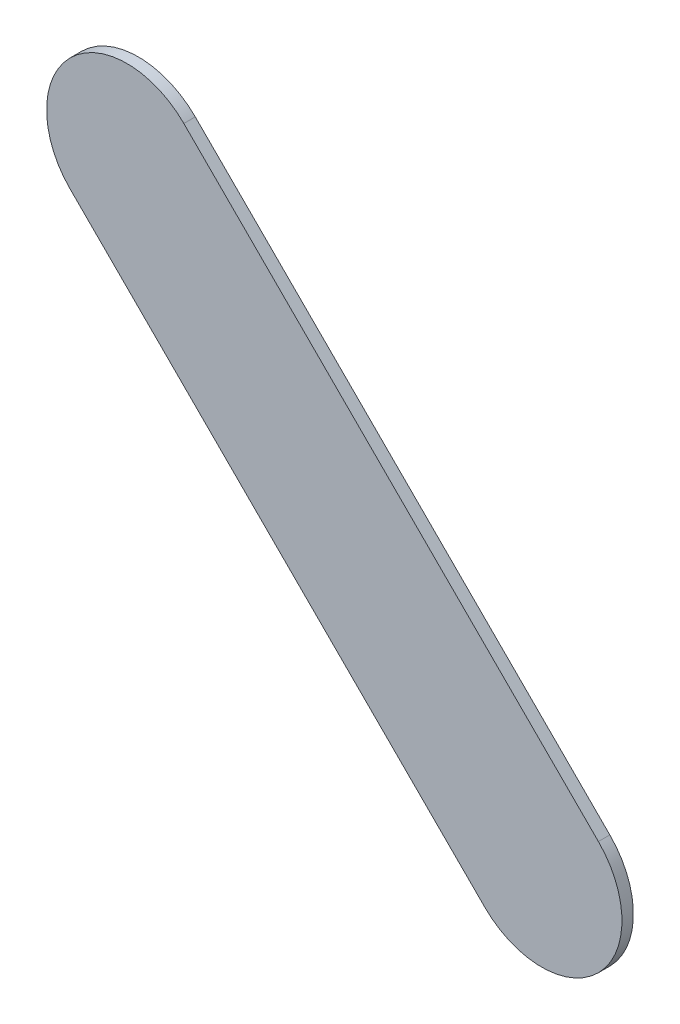
ISO-10303-21;
HEADER;
FILE_DESCRIPTION(('STEP AP214'),'2;1');
FILE_NAME('part.step','',(''),(''),'','','');
FILE_SCHEMA(('AUTOMOTIVE_DESIGN { 1 0 10303 214 1 1 1 1 }'));
ENDSEC;
DATA;
#1=APPLICATION_CONTEXT('core data for automotive mechanical design processes');
#2=APPLICATION_PROTOCOL_DEFINITION('international standard','automotive_design',2000,#1);
#3=PRODUCT_CONTEXT('',#1,'mechanical');
#4=PRODUCT('Part','Part','',(#3));
#5=PRODUCT_RELATED_PRODUCT_CATEGORY('part','',(#4));
#6=PRODUCT_DEFINITION_FORMATION('','',#4);
#7=PRODUCT_DEFINITION_CONTEXT('part definition',#1,'design');
#8=PRODUCT_DEFINITION('design','',#6,#7);
#9=PRODUCT_DEFINITION_SHAPE('','',#8);
#10=(LENGTH_UNIT() NAMED_UNIT(*) SI_UNIT(.MILLI.,.METRE.));
#11=(NAMED_UNIT(*) PLANE_ANGLE_UNIT() SI_UNIT($,.RADIAN.));
#12=(NAMED_UNIT(*) SI_UNIT($,.STERADIAN.) SOLID_ANGLE_UNIT());
#13=UNCERTAINTY_MEASURE_WITH_UNIT(LENGTH_MEASURE(1.E-05),#10,'distance_accuracy_value','');
#14=(GEOMETRIC_REPRESENTATION_CONTEXT(3) GLOBAL_UNCERTAINTY_ASSIGNED_CONTEXT((#13)) GLOBAL_UNIT_ASSIGNED_CONTEXT((#10,
#11,#12)) REPRESENTATION_CONTEXT('',''));
#15=CARTESIAN_POINT('',(0.,0.,0.));
#16=DIRECTION('',(0.,0.,1.));
#17=DIRECTION('',(1.,0.,0.));
#18=AXIS2_PLACEMENT_3D('',#15,#16,#17);
#19=CARTESIAN_POINT('',(99.72320162,114.74309538,0.));
#20=DIRECTION('',(0.707106781186548,0.707106781186548,0.));
#21=DIRECTION('',(0.707106781186548,-0.707106781186548,0.));
#22=AXIS2_PLACEMENT_3D('',#19,#20,#21);
#23=PLANE('',#22);
#24=DIRECTION('',(0.707106781186548,-0.707106781186548,0.));
#25=VECTOR('',#24,1.);
#26=CARTESIAN_POINT('',(99.72320162,114.74309538,0.03556));
#27=LINE('',#26,#25);
#28=CARTESIAN_POINT('',(99.72320162,114.74309538,0.03556));
#29=VERTEX_POINT('',#28);
#30=CARTESIAN_POINT('',(101.01276978,113.45352722,0.03556));
#31=VERTEX_POINT('',#30);
#32=EDGE_CURVE('E11',#29,#31,#27,.T.);
#33=ORIENTED_EDGE('',*,*,#32,.F.);
#34=DIRECTION('',(0.,0.,1.));
#35=VECTOR('',#34,1.);
#36=CARTESIAN_POINT('',(99.72320162,114.74309538,0.));
#37=LINE('',#36,#35);
#38=CARTESIAN_POINT('',(99.72320162,114.74309538,0.));
#39=VERTEX_POINT('',#38);
#40=EDGE_CURVE('E24',#39,#29,#37,.T.);
#41=ORIENTED_EDGE('',*,*,#40,.F.);
#42=DIRECTION('',(0.707106781186548,-0.707106781186548,0.));
#43=VECTOR('',#42,1.);
#44=CARTESIAN_POINT('',(99.72320162,114.74309538,0.));
#45=LINE('',#44,#43);
#46=CARTESIAN_POINT('',(101.01276978,113.45352722,0.));
#47=VERTEX_POINT('',#46);
#48=EDGE_CURVE('E75',#39,#47,#45,.T.);
#49=ORIENTED_EDGE('',*,*,#48,.T.);
#50=DIRECTION('',(0.,0.,1.));
#51=VECTOR('',#50,1.);
#52=CARTESIAN_POINT('',(101.01276978,113.45352722,0.));
#53=LINE('',#52,#51);
#54=EDGE_CURVE('E37',#47,#31,#53,.T.);
#55=ORIENTED_EDGE('',*,*,#54,.T.);
#56=EDGE_LOOP('',(#33,#41,#49,#55));
#57=FACE_BOUND('',#56,.T.);
#58=ADVANCED_FACE('F17',(#57),#23,.F.);
#59=CARTESIAN_POINT('',(101.18954616,113.6303036,0.));
#60=DIRECTION('',(0.,0.,-1.));
#61=DIRECTION('',(-0.707106781186548,-0.707106781186548,0.));
#62=AXIS2_PLACEMENT_3D('',#59,#60,#61);
#63=CYLINDRICAL_SURFACE('',#62,0.24999955410322);
#64=CARTESIAN_POINT('',(101.18954616,113.6303036,0.03556));
#65=DIRECTION('',(0.,0.,1.));
#66=DIRECTION('',(-0.707106781186548,-0.707106781186548,0.));
#67=AXIS2_PLACEMENT_3D('',#64,#65,#66);
#68=CIRCLE('',#67,0.24999955410322);
#69=CARTESIAN_POINT('',(101.36632254,113.80707998,0.03556));
#70=VERTEX_POINT('',#69);
#71=EDGE_CURVE('E83',#31,#70,#68,.T.);
#72=ORIENTED_EDGE('',*,*,#71,.F.);
#73=ORIENTED_EDGE('',*,*,#54,.F.);
#74=CARTESIAN_POINT('',(101.18954616,113.6303036,0.));
#75=DIRECTION('',(0.,0.,1.));
#76=DIRECTION('',(-0.707106781186548,-0.707106781186548,0.));
#77=AXIS2_PLACEMENT_3D('',#74,#75,#76);
#78=CIRCLE('',#77,0.24999955410322);
#79=CARTESIAN_POINT('',(101.36632254,113.80707998,0.));
#80=VERTEX_POINT('',#79);
#81=EDGE_CURVE('E81',#47,#80,#78,.T.);
#82=ORIENTED_EDGE('',*,*,#81,.T.);
#83=DIRECTION('',(0.,0.,1.));
#84=VECTOR('',#83,1.);
#85=CARTESIAN_POINT('',(101.36632254,113.80707998,0.));
#86=LINE('',#85,#84);
#87=EDGE_CURVE('E67',#80,#70,#86,.T.);
#88=ORIENTED_EDGE('',*,*,#87,.T.);
#89=EDGE_LOOP('',(#72,#73,#82,#88));
#90=FACE_BOUND('',#89,.T.);
#91=ADVANCED_FACE('F89',(#90),#63,.T.);
#92=CARTESIAN_POINT('',(101.36632254,113.80707998,0.));
#93=DIRECTION('',(-0.707106781186548,-0.707106781186548,0.));
#94=DIRECTION('',(-0.707106781186548,0.707106781186548,0.));
#95=AXIS2_PLACEMENT_3D('',#92,#93,#94);
#96=PLANE('',#95);
#97=DIRECTION('',(-0.707106781186548,0.707106781186548,0.));
#98=VECTOR('',#97,1.);
#99=CARTESIAN_POINT('',(101.36632254,113.80707998,0.03556));
#100=LINE('',#99,#98);
#101=CARTESIAN_POINT('',(100.07675438,115.09664814,0.03556));
#102=VERTEX_POINT('',#101);
#103=EDGE_CURVE('E71',#70,#102,#100,.T.);
#104=ORIENTED_EDGE('',*,*,#103,.F.);
#105=ORIENTED_EDGE('',*,*,#87,.F.);
#106=DIRECTION('',(-0.707106781186548,0.707106781186548,0.));
#107=VECTOR('',#106,1.);
#108=CARTESIAN_POINT('',(101.36632254,113.80707998,0.));
#109=LINE('',#108,#107);
#110=CARTESIAN_POINT('',(100.07675438,115.09664814,0.));
#111=VERTEX_POINT('',#110);
#112=EDGE_CURVE('E63',#80,#111,#109,.T.);
#113=ORIENTED_EDGE('',*,*,#112,.T.);
#114=DIRECTION('',(0.,0.,1.));
#115=VECTOR('',#114,1.);
#116=CARTESIAN_POINT('',(100.07675438,115.09664814,0.));
#117=LINE('',#116,#115);
#118=EDGE_CURVE('E53',#111,#102,#117,.T.);
#119=ORIENTED_EDGE('',*,*,#118,.T.);
#120=EDGE_LOOP('',(#104,#105,#113,#119));
#121=FACE_BOUND('',#120,.T.);
#122=ADVANCED_FACE('F66',(#121),#96,.F.);
#123=CARTESIAN_POINT('',(99.899978,114.91987176,0.));
#124=DIRECTION('',(0.,0.,-1.));
#125=DIRECTION('',(0.707106781186548,0.707106781186548,0.));
#126=AXIS2_PLACEMENT_3D('',#123,#124,#125);
#127=CYLINDRICAL_SURFACE('',#126,0.24999955410322);
#128=CARTESIAN_POINT('',(99.899978,114.91987176,0.03556));
#129=DIRECTION('',(0.,0.,1.));
#130=DIRECTION('',(0.707106781186548,0.707106781186548,0.));
#131=AXIS2_PLACEMENT_3D('',#128,#129,#130);
#132=CIRCLE('',#131,0.24999955410322);
#133=EDGE_CURVE('E59',#102,#29,#132,.T.);
#134=ORIENTED_EDGE('',*,*,#133,.F.);
#135=ORIENTED_EDGE('',*,*,#118,.F.);
#136=CARTESIAN_POINT('',(99.899978,114.91987176,0.));
#137=DIRECTION('',(0.,0.,1.));
#138=DIRECTION('',(0.707106781186548,0.707106781186548,0.));
#139=AXIS2_PLACEMENT_3D('',#136,#137,#138);
#140=CIRCLE('',#139,0.24999955410322);
#141=EDGE_CURVE('E57',#111,#39,#140,.T.);
#142=ORIENTED_EDGE('',*,*,#141,.T.);
#143=ORIENTED_EDGE('',*,*,#40,.T.);
#144=EDGE_LOOP('',(#134,#135,#142,#143));
#145=FACE_BOUND('',#144,.T.);
#146=ADVANCED_FACE('F55',(#145),#127,.T.);
#147=CARTESIAN_POINT('',(99.72320162,114.74309538,0.));
#148=DIRECTION('',(0.,0.,-1.));
#149=DIRECTION('',(-1.,0.,0.));
#150=AXIS2_PLACEMENT_3D('',#147,#148,#149);
#151=PLANE('',#150);
#152=ORIENTED_EDGE('',*,*,#141,.F.);
#153=ORIENTED_EDGE('',*,*,#112,.F.);
#154=ORIENTED_EDGE('',*,*,#81,.F.);
#155=ORIENTED_EDGE('',*,*,#48,.F.);
#156=EDGE_LOOP('',(#152,#153,#154,#155));
#157=FACE_BOUND('',#156,.T.);
#158=ADVANCED_FACE('F74',(#157),#151,.T.);
#159=CARTESIAN_POINT('',(99.72320162,114.74309538,0.03556));
#160=DIRECTION('',(0.,0.,-1.));
#161=DIRECTION('',(-1.,0.,0.));
#162=AXIS2_PLACEMENT_3D('',#159,#160,#161);
#163=PLANE('',#162);
#164=ORIENTED_EDGE('',*,*,#32,.T.);
#165=ORIENTED_EDGE('',*,*,#71,.T.);
#166=ORIENTED_EDGE('',*,*,#103,.T.);
#167=ORIENTED_EDGE('',*,*,#133,.T.);
#168=EDGE_LOOP('',(#164,#165,#166,#167));
#169=FACE_BOUND('',#168,.T.);
#170=ADVANCED_FACE('F91',(#169),#163,.F.);
#171=CLOSED_SHELL('',(#58,#91,#122,#146,#158,#170));
#172=MANIFOLD_SOLID_BREP('B1',#171);
#173=ADVANCED_BREP_SHAPE_REPRESENTATION('',(#18,#172),#14);
#174=SHAPE_DEFINITION_REPRESENTATION(#9,#173);
ENDSEC;
END-ISO-10303-21;
